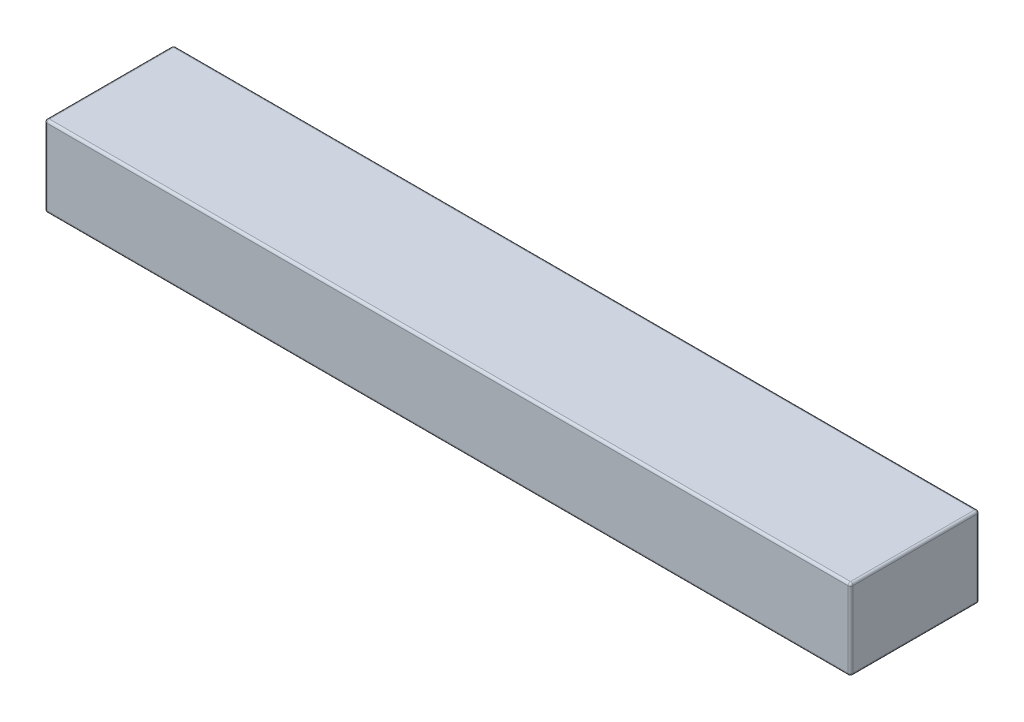
ISO-10303-21;
HEADER;
FILE_DESCRIPTION(('STEP AP214'),'2;1');
FILE_NAME('part.step','',(''),(''),'','','');
FILE_SCHEMA(('AUTOMOTIVE_DESIGN { 1 0 10303 214 1 1 1 1 }'));
ENDSEC;
DATA;
#1=APPLICATION_CONTEXT('core data for automotive mechanical design processes');
#2=APPLICATION_PROTOCOL_DEFINITION('international standard','automotive_design',2000,#1);
#3=PRODUCT_CONTEXT('',#1,'mechanical');
#4=PRODUCT('Part','Part','',(#3));
#5=PRODUCT_RELATED_PRODUCT_CATEGORY('part','',(#4));
#6=PRODUCT_DEFINITION_FORMATION('','',#4);
#7=PRODUCT_DEFINITION_CONTEXT('part definition',#1,'design');
#8=PRODUCT_DEFINITION('design','',#6,#7);
#9=PRODUCT_DEFINITION_SHAPE('','',#8);
#10=(LENGTH_UNIT() NAMED_UNIT(*) SI_UNIT(.MILLI.,.METRE.));
#11=(NAMED_UNIT(*) PLANE_ANGLE_UNIT() SI_UNIT($,.RADIAN.));
#12=(NAMED_UNIT(*) SI_UNIT($,.STERADIAN.) SOLID_ANGLE_UNIT());
#13=UNCERTAINTY_MEASURE_WITH_UNIT(LENGTH_MEASURE(1.E-05),#10,'distance_accuracy_value','');
#14=(GEOMETRIC_REPRESENTATION_CONTEXT(3) GLOBAL_UNCERTAINTY_ASSIGNED_CONTEXT((#13)) GLOBAL_UNIT_ASSIGNED_CONTEXT((#10,
#11,#12)) REPRESENTATION_CONTEXT('',''));
#15=CARTESIAN_POINT('',(0.,0.,0.));
#16=DIRECTION('',(0.,0.,1.));
#17=DIRECTION('',(1.,0.,0.));
#18=AXIS2_PLACEMENT_3D('',#15,#16,#17);
#19=CARTESIAN_POINT('',(50.,-5.4,7.7));
#20=DIRECTION('',(-1.,0.,0.));
#21=DIRECTION('',(0.,0.,1.));
#22=AXIS2_PLACEMENT_3D('',#19,#20,#21);
#23=CYLINDRICAL_SURFACE('',#22,0.3);
#24=DIRECTION('',(-1.,0.,0.));
#25=VECTOR('',#24,1.);
#26=CARTESIAN_POINT('',(50.,-5.4,8.));
#27=LINE('',#26,#25);
#28=CARTESIAN_POINT('',(49.7,-5.4,8.));
#29=VERTEX_POINT('',#28);
#30=CARTESIAN_POINT('',(-49.7,-5.4,8.));
#31=VERTEX_POINT('',#30);
#32=EDGE_CURVE('E229',#29,#31,#27,.T.);
#33=ORIENTED_EDGE('',*,*,#32,.T.);
#34=CARTESIAN_POINT('',(-49.7,-5.4,7.7));
#35=DIRECTION('',(-1.,0.,0.));
#36=DIRECTION('',(0.,0.,1.));
#37=AXIS2_PLACEMENT_3D('',#34,#35,#36);
#38=CIRCLE('',#37,0.3);
#39=CARTESIAN_POINT('',(-49.7,-5.7,7.7));
#40=VERTEX_POINT('',#39);
#41=EDGE_CURVE('E201',#31,#40,#38,.F.);
#42=ORIENTED_EDGE('',*,*,#41,.T.);
#43=DIRECTION('',(-1.,0.,0.));
#44=VECTOR('',#43,1.);
#45=CARTESIAN_POINT('',(50.,-5.7,7.7));
#46=LINE('',#45,#44);
#47=CARTESIAN_POINT('',(49.7,-5.7,7.7));
#48=VERTEX_POINT('',#47);
#49=EDGE_CURVE('E149',#48,#40,#46,.T.);
#50=ORIENTED_EDGE('',*,*,#49,.F.);
#51=CARTESIAN_POINT('',(49.7,-5.4,7.7));
#52=DIRECTION('',(-1.,0.,0.));
#53=DIRECTION('',(0.,0.,1.));
#54=AXIS2_PLACEMENT_3D('',#51,#52,#53);
#55=CIRCLE('',#54,0.3);
#56=EDGE_CURVE('E199',#48,#29,#55,.T.);
#57=ORIENTED_EDGE('',*,*,#56,.T.);
#58=EDGE_LOOP('',(#33,#42,#50,#57));
#59=FACE_BOUND('',#58,.T.);
#60=ADVANCED_FACE('F37',(#59),#23,.T.);
#61=CARTESIAN_POINT('',(50.,-5.7,7.7));
#62=DIRECTION('',(0.,1.,0.));
#63=DIRECTION('',(0.,0.,1.));
#64=AXIS2_PLACEMENT_3D('',#61,#62,#63);
#65=PLANE('',#64);
#66=ORIENTED_EDGE('',*,*,#49,.T.);
#67=DIRECTION('',(0.,0.,-1.));
#68=VECTOR('',#67,1.);
#69=CARTESIAN_POINT('',(-49.7,-5.7,-7.7));
#70=LINE('',#69,#68);
#71=CARTESIAN_POINT('',(-49.7,-5.7,-7.7));
#72=VERTEX_POINT('',#71);
#73=EDGE_CURVE('E148',#40,#72,#70,.T.);
#74=ORIENTED_EDGE('',*,*,#73,.T.);
#75=DIRECTION('',(-1.,0.,0.));
#76=VECTOR('',#75,1.);
#77=CARTESIAN_POINT('',(50.,-5.7,-7.7));
#78=LINE('',#77,#76);
#79=CARTESIAN_POINT('',(49.7,-5.7,-7.7));
#80=VERTEX_POINT('',#79);
#81=EDGE_CURVE('E130',#80,#72,#78,.T.);
#82=ORIENTED_EDGE('',*,*,#81,.F.);
#83=DIRECTION('',(0.,0.,-1.));
#84=VECTOR('',#83,1.);
#85=CARTESIAN_POINT('',(49.7,-5.7,7.7));
#86=LINE('',#85,#84);
#87=EDGE_CURVE('E145',#80,#48,#86,.F.);
#88=ORIENTED_EDGE('',*,*,#87,.T.);
#89=EDGE_LOOP('',(#66,#74,#82,#88));
#90=FACE_BOUND('',#89,.T.);
#91=ADVANCED_FACE('F143',(#90),#65,.F.);
#92=CARTESIAN_POINT('',(50.,-5.4,-7.7));
#93=DIRECTION('',(-1.,0.,0.));
#94=DIRECTION('',(0.,0.,1.));
#95=AXIS2_PLACEMENT_3D('',#92,#93,#94);
#96=CYLINDRICAL_SURFACE('',#95,0.3);
#97=ORIENTED_EDGE('',*,*,#81,.T.);
#98=CARTESIAN_POINT('',(-49.7,-5.4,-7.7));
#99=DIRECTION('',(-1.,0.,0.));
#100=DIRECTION('',(0.,0.,1.));
#101=AXIS2_PLACEMENT_3D('',#98,#99,#100);
#102=CIRCLE('',#101,0.3);
#103=CARTESIAN_POINT('',(-49.7,-5.4,-8.));
#104=VERTEX_POINT('',#103);
#105=EDGE_CURVE('E137',#72,#104,#102,.F.);
#106=ORIENTED_EDGE('',*,*,#105,.T.);
#107=DIRECTION('',(-1.,0.,0.));
#108=VECTOR('',#107,1.);
#109=CARTESIAN_POINT('',(50.,-5.4,-8.));
#110=LINE('',#109,#108);
#111=CARTESIAN_POINT('',(49.7,-5.4,-8.));
#112=VERTEX_POINT('',#111);
#113=EDGE_CURVE('E132',#112,#104,#110,.T.);
#114=ORIENTED_EDGE('',*,*,#113,.F.);
#115=CARTESIAN_POINT('',(49.7,-5.4,-7.7));
#116=DIRECTION('',(-1.,0.,0.));
#117=DIRECTION('',(0.,0.,1.));
#118=AXIS2_PLACEMENT_3D('',#115,#116,#117);
#119=CIRCLE('',#118,0.3);
#120=EDGE_CURVE('E127',#112,#80,#119,.T.);
#121=ORIENTED_EDGE('',*,*,#120,.T.);
#122=EDGE_LOOP('',(#97,#106,#114,#121));
#123=FACE_BOUND('',#122,.T.);
#124=ADVANCED_FACE('F129',(#123),#96,.T.);
#125=CARTESIAN_POINT('',(50.,-5.4,-8.));
#126=DIRECTION('',(0.,0.,1.));
#127=DIRECTION('',(1.,0.,0.));
#128=AXIS2_PLACEMENT_3D('',#125,#126,#127);
#129=PLANE('',#128);
#130=ORIENTED_EDGE('',*,*,#113,.T.);
#131=DIRECTION('',(0.,1.,0.));
#132=VECTOR('',#131,1.);
#133=CARTESIAN_POINT('',(-49.7,4.,-8.));
#134=LINE('',#133,#132);
#135=CARTESIAN_POINT('',(-49.7,4.,-8.));
#136=VERTEX_POINT('',#135);
#137=EDGE_CURVE('E180',#104,#136,#134,.T.);
#138=ORIENTED_EDGE('',*,*,#137,.T.);
#139=DIRECTION('',(-1.,0.,0.));
#140=VECTOR('',#139,1.);
#141=CARTESIAN_POINT('',(50.,4.,-8.));
#142=LINE('',#141,#140);
#143=CARTESIAN_POINT('',(49.7,4.,-8.));
#144=VERTEX_POINT('',#143);
#145=EDGE_CURVE('E250',#144,#136,#142,.T.);
#146=ORIENTED_EDGE('',*,*,#145,.F.);
#147=DIRECTION('',(0.,1.,0.));
#148=VECTOR('',#147,1.);
#149=CARTESIAN_POINT('',(49.7,-5.4,-8.));
#150=LINE('',#149,#148);
#151=EDGE_CURVE('E178',#144,#112,#150,.F.);
#152=ORIENTED_EDGE('',*,*,#151,.T.);
#153=EDGE_LOOP('',(#130,#138,#146,#152));
#154=FACE_BOUND('',#153,.T.);
#155=ADVANCED_FACE('F247',(#154),#129,.F.);
#156=CARTESIAN_POINT('',(50.,4.,-7.7));
#157=DIRECTION('',(-1.,0.,0.));
#158=DIRECTION('',(0.,0.,1.));
#159=AXIS2_PLACEMENT_3D('',#156,#157,#158);
#160=CYLINDRICAL_SURFACE('',#159,0.299999999999999);
#161=ORIENTED_EDGE('',*,*,#145,.T.);
#162=CARTESIAN_POINT('',(-49.7,4.,-7.7));
#163=DIRECTION('',(-1.,0.,0.));
#164=DIRECTION('',(0.,0.,1.));
#165=AXIS2_PLACEMENT_3D('',#162,#163,#164);
#166=CIRCLE('',#165,0.299999999999999);
#167=CARTESIAN_POINT('',(-49.7,4.3,-7.7));
#168=VERTEX_POINT('',#167);
#169=EDGE_CURVE('E184',#136,#168,#166,.F.);
#170=ORIENTED_EDGE('',*,*,#169,.T.);
#171=DIRECTION('',(-1.,0.,0.));
#172=VECTOR('',#171,1.);
#173=CARTESIAN_POINT('',(50.,4.3,-7.7));
#174=LINE('',#173,#172);
#175=CARTESIAN_POINT('',(49.7,4.3,-7.7));
#176=VERTEX_POINT('',#175);
#177=EDGE_CURVE('E253',#176,#168,#174,.T.);
#178=ORIENTED_EDGE('',*,*,#177,.F.);
#179=CARTESIAN_POINT('',(49.7,4.,-7.7));
#180=DIRECTION('',(-1.,0.,0.));
#181=DIRECTION('',(0.,0.,1.));
#182=AXIS2_PLACEMENT_3D('',#179,#180,#181);
#183=CIRCLE('',#182,0.299999999999999);
#184=EDGE_CURVE('E182',#176,#144,#183,.T.);
#185=ORIENTED_EDGE('',*,*,#184,.T.);
#186=EDGE_LOOP('',(#161,#170,#178,#185));
#187=FACE_BOUND('',#186,.T.);
#188=ADVANCED_FACE('F295',(#187),#160,.T.);
#189=CARTESIAN_POINT('',(50.,4.3,7.7));
#190=DIRECTION('',(0.,-1.,0.));
#191=DIRECTION('',(0.,0.,-1.));
#192=AXIS2_PLACEMENT_3D('',#189,#190,#191);
#193=PLANE('',#192);
#194=ORIENTED_EDGE('',*,*,#177,.T.);
#195=DIRECTION('',(0.,0.,1.));
#196=VECTOR('',#195,1.);
#197=CARTESIAN_POINT('',(-49.7,4.3,7.7));
#198=LINE('',#197,#196);
#199=CARTESIAN_POINT('',(-49.7,4.3,7.7));
#200=VERTEX_POINT('',#199);
#201=EDGE_CURVE('E188',#168,#200,#198,.T.);
#202=ORIENTED_EDGE('',*,*,#201,.T.);
#203=DIRECTION('',(-1.,0.,0.));
#204=VECTOR('',#203,1.);
#205=CARTESIAN_POINT('',(50.,4.3,7.7));
#206=LINE('',#205,#204);
#207=CARTESIAN_POINT('',(49.7,4.3,7.7));
#208=VERTEX_POINT('',#207);
#209=EDGE_CURVE('E257',#208,#200,#206,.T.);
#210=ORIENTED_EDGE('',*,*,#209,.F.);
#211=DIRECTION('',(0.,0.,1.));
#212=VECTOR('',#211,1.);
#213=CARTESIAN_POINT('',(49.7,4.3,7.7));
#214=LINE('',#213,#212);
#215=EDGE_CURVE('E186',#208,#176,#214,.F.);
#216=ORIENTED_EDGE('',*,*,#215,.T.);
#217=EDGE_LOOP('',(#194,#202,#210,#216));
#218=FACE_BOUND('',#217,.T.);
#219=ADVANCED_FACE('F298',(#218),#193,.F.);
#220=CARTESIAN_POINT('',(50.,4.,7.7));
#221=DIRECTION('',(-1.,0.,0.));
#222=DIRECTION('',(0.,0.,1.));
#223=AXIS2_PLACEMENT_3D('',#220,#221,#222);
#224=CYLINDRICAL_SURFACE('',#223,0.299999999999999);
#225=ORIENTED_EDGE('',*,*,#209,.T.);
#226=CARTESIAN_POINT('',(-49.7,4.,7.7));
#227=DIRECTION('',(-1.,0.,0.));
#228=DIRECTION('',(0.,0.,1.));
#229=AXIS2_PLACEMENT_3D('',#226,#227,#228);
#230=CIRCLE('',#229,0.299999999999999);
#231=CARTESIAN_POINT('',(-49.7,4.,8.));
#232=VERTEX_POINT('',#231);
#233=EDGE_CURVE('E192',#200,#232,#230,.F.);
#234=ORIENTED_EDGE('',*,*,#233,.T.);
#235=DIRECTION('',(-1.,0.,0.));
#236=VECTOR('',#235,1.);
#237=CARTESIAN_POINT('',(50.,4.,8.));
#238=LINE('',#237,#236);
#239=CARTESIAN_POINT('',(49.7,4.,8.));
#240=VERTEX_POINT('',#239);
#241=EDGE_CURVE('E262',#240,#232,#238,.T.);
#242=ORIENTED_EDGE('',*,*,#241,.F.);
#243=CARTESIAN_POINT('',(49.7,4.,7.7));
#244=DIRECTION('',(-1.,0.,0.));
#245=DIRECTION('',(0.,0.,1.));
#246=AXIS2_PLACEMENT_3D('',#243,#244,#245);
#247=CIRCLE('',#246,0.299999999999999);
#248=EDGE_CURVE('E190',#240,#208,#247,.T.);
#249=ORIENTED_EDGE('',*,*,#248,.T.);
#250=EDGE_LOOP('',(#225,#234,#242,#249));
#251=FACE_BOUND('',#250,.T.);
#252=ADVANCED_FACE('F311',(#251),#224,.T.);
#253=CARTESIAN_POINT('',(50.,-5.4,8.));
#254=DIRECTION('',(0.,0.,-1.));
#255=DIRECTION('',(-1.,0.,0.));
#256=AXIS2_PLACEMENT_3D('',#253,#254,#255);
#257=PLANE('',#256);
#258=ORIENTED_EDGE('',*,*,#241,.T.);
#259=DIRECTION('',(0.,-1.,0.));
#260=VECTOR('',#259,1.);
#261=CARTESIAN_POINT('',(-49.7,-5.4,8.));
#262=LINE('',#261,#260);
#263=EDGE_CURVE('E197',#232,#31,#262,.T.);
#264=ORIENTED_EDGE('',*,*,#263,.T.);
#265=ORIENTED_EDGE('',*,*,#32,.F.);
#266=DIRECTION('',(0.,-1.,0.));
#267=VECTOR('',#266,1.);
#268=CARTESIAN_POINT('',(49.7,-5.4,8.));
#269=LINE('',#268,#267);
#270=EDGE_CURVE('E194',#29,#240,#269,.F.);
#271=ORIENTED_EDGE('',*,*,#270,.T.);
#272=EDGE_LOOP('',(#258,#264,#265,#271));
#273=FACE_BOUND('',#272,.T.);
#274=ADVANCED_FACE('F312',(#273),#257,.F.);
#275=CARTESIAN_POINT('',(50.,-5.4,7.7));
#276=DIRECTION('',(-1.,0.,0.));
#277=DIRECTION('',(0.,0.,1.));
#278=AXIS2_PLACEMENT_3D('',#275,#276,#277);
#279=PLANE('',#278);
#280=DIRECTION('',(0.,0.,1.));
#281=VECTOR('',#280,1.);
#282=CARTESIAN_POINT('',(50.,4.,7.7));
#283=LINE('',#282,#281);
#284=CARTESIAN_POINT('',(50.,4.,-7.7));
#285=VERTEX_POINT('',#284);
#286=CARTESIAN_POINT('',(50.,4.,7.7));
#287=VERTEX_POINT('',#286);
#288=EDGE_CURVE('E46',#285,#287,#283,.T.);
#289=ORIENTED_EDGE('',*,*,#288,.T.);
#290=DIRECTION('',(0.,-1.,0.));
#291=VECTOR('',#290,1.);
#292=CARTESIAN_POINT('',(50.,-5.4,7.7));
#293=LINE('',#292,#291);
#294=CARTESIAN_POINT('',(50.,-5.4,7.7));
#295=VERTEX_POINT('',#294);
#296=EDGE_CURVE('E11',#287,#295,#293,.T.);
#297=ORIENTED_EDGE('',*,*,#296,.T.);
#298=DIRECTION('',(0.,0.,-1.));
#299=VECTOR('',#298,1.);
#300=CARTESIAN_POINT('',(50.,-5.4,7.7));
#301=LINE('',#300,#299);
#302=CARTESIAN_POINT('',(50.,-5.4,-7.7));
#303=VERTEX_POINT('',#302);
#304=EDGE_CURVE('E203',#295,#303,#301,.T.);
#305=ORIENTED_EDGE('',*,*,#304,.T.);
#306=DIRECTION('',(0.,1.,0.));
#307=VECTOR('',#306,1.);
#308=CARTESIAN_POINT('',(50.,-5.4,-7.7));
#309=LINE('',#308,#307);
#310=EDGE_CURVE('E57',#303,#285,#309,.T.);
#311=ORIENTED_EDGE('',*,*,#310,.T.);
#312=EDGE_LOOP('',(#289,#297,#305,#311));
#313=FACE_BOUND('',#312,.T.);
#314=ADVANCED_FACE('F321',(#313),#279,.F.);
#315=CARTESIAN_POINT('',(-50.,-5.4,7.7));
#316=DIRECTION('',(-1.,0.,0.));
#317=DIRECTION('',(0.,0.,1.));
#318=AXIS2_PLACEMENT_3D('',#315,#316,#317);
#319=PLANE('',#318);
#320=DIRECTION('',(0.,1.,0.));
#321=VECTOR('',#320,1.);
#322=CARTESIAN_POINT('',(-50.,-5.4,-7.7));
#323=LINE('',#322,#321);
#324=CARTESIAN_POINT('',(-50.,4.,-7.7));
#325=VERTEX_POINT('',#324);
#326=CARTESIAN_POINT('',(-50.,-5.4,-7.7));
#327=VERTEX_POINT('',#326);
#328=EDGE_CURVE('E173',#325,#327,#323,.F.);
#329=ORIENTED_EDGE('',*,*,#328,.T.);
#330=DIRECTION('',(0.,0.,-1.));
#331=VECTOR('',#330,1.);
#332=CARTESIAN_POINT('',(-50.,-5.4,7.7));
#333=LINE('',#332,#331);
#334=CARTESIAN_POINT('',(-50.,-5.4,7.7));
#335=VERTEX_POINT('',#334);
#336=EDGE_CURVE('E138',#327,#335,#333,.F.);
#337=ORIENTED_EDGE('',*,*,#336,.T.);
#338=DIRECTION('',(0.,-1.,0.));
#339=VECTOR('',#338,1.);
#340=CARTESIAN_POINT('',(-50.,4.,7.7));
#341=LINE('',#340,#339);
#342=CARTESIAN_POINT('',(-50.,4.,7.7));
#343=VERTEX_POINT('',#342);
#344=EDGE_CURVE('E166',#335,#343,#341,.F.);
#345=ORIENTED_EDGE('',*,*,#344,.T.);
#346=DIRECTION('',(0.,0.,1.));
#347=VECTOR('',#346,1.);
#348=CARTESIAN_POINT('',(-50.,4.,-7.7));
#349=LINE('',#348,#347);
#350=EDGE_CURVE('E171',#343,#325,#349,.F.);
#351=ORIENTED_EDGE('',*,*,#350,.T.);
#352=EDGE_LOOP('',(#329,#337,#345,#351));
#353=FACE_BOUND('',#352,.T.);
#354=ADVANCED_FACE('F323',(#353),#319,.T.);
#355=CARTESIAN_POINT('',(-49.7,4.,7.7));
#356=DIRECTION('',(0.,0.,-1.));
#357=DIRECTION('',(-1.,0.,0.));
#358=AXIS2_PLACEMENT_3D('',#355,#356,#357);
#359=CYLINDRICAL_SURFACE('',#358,0.3);
#360=CARTESIAN_POINT('',(-49.7,4.,7.7));
#361=DIRECTION('',(0.,0.,1.));
#362=DIRECTION('',(1.,0.,0.));
#363=AXIS2_PLACEMENT_3D('',#360,#361,#362);
#364=CIRCLE('',#363,0.3);
#365=EDGE_CURVE('E226',#200,#343,#364,.T.);
#366=ORIENTED_EDGE('',*,*,#365,.F.);
#367=ORIENTED_EDGE('',*,*,#201,.F.);
#368=CARTESIAN_POINT('',(-49.7,4.,-7.7));
#369=DIRECTION('',(0.,0.,-1.));
#370=DIRECTION('',(-1.,0.,0.));
#371=AXIS2_PLACEMENT_3D('',#368,#369,#370);
#372=CIRCLE('',#371,0.3);
#373=EDGE_CURVE('E223',#325,#168,#372,.T.);
#374=ORIENTED_EDGE('',*,*,#373,.F.);
#375=ORIENTED_EDGE('',*,*,#350,.F.);
#376=EDGE_LOOP('',(#366,#367,#374,#375));
#377=FACE_BOUND('',#376,.T.);
#378=ADVANCED_FACE('F303',(#377),#359,.T.);
#379=CARTESIAN_POINT('',(-49.7,4.,7.7));
#380=DIRECTION('',(-1.,0.,0.));
#381=DIRECTION('',(0.,0.,1.));
#382=AXIS2_PLACEMENT_3D('',#379,#380,#381);
#383=SPHERICAL_SURFACE('',#382,0.3);
#384=ORIENTED_EDGE('',*,*,#233,.F.);
#385=ORIENTED_EDGE('',*,*,#365,.T.);
#386=CARTESIAN_POINT('',(-49.7,4.,7.7));
#387=DIRECTION('',(0.,-1.,0.));
#388=DIRECTION('',(0.,0.,-1.));
#389=AXIS2_PLACEMENT_3D('',#386,#387,#388);
#390=CIRCLE('',#389,0.3);
#391=EDGE_CURVE('E220',#232,#343,#390,.T.);
#392=ORIENTED_EDGE('',*,*,#391,.F.);
#393=EDGE_LOOP('',(#384,#385,#392));
#394=FACE_BOUND('',#393,.T.);
#395=ADVANCED_FACE('F308',(#394),#383,.T.);
#396=CARTESIAN_POINT('',(-49.7,4.,-7.7));
#397=DIRECTION('',(-1.,0.,0.));
#398=DIRECTION('',(0.,0.,1.));
#399=AXIS2_PLACEMENT_3D('',#396,#397,#398);
#400=SPHERICAL_SURFACE('',#399,0.3);
#401=ORIENTED_EDGE('',*,*,#373,.T.);
#402=ORIENTED_EDGE('',*,*,#169,.F.);
#403=CARTESIAN_POINT('',(-49.7,4.,-7.7));
#404=DIRECTION('',(0.,-1.,0.));
#405=DIRECTION('',(0.,0.,-1.));
#406=AXIS2_PLACEMENT_3D('',#403,#404,#405);
#407=CIRCLE('',#406,0.3);
#408=EDGE_CURVE('E217',#325,#136,#407,.T.);
#409=ORIENTED_EDGE('',*,*,#408,.F.);
#410=EDGE_LOOP('',(#401,#402,#409));
#411=FACE_BOUND('',#410,.T.);
#412=ADVANCED_FACE('F292',(#411),#400,.T.);
#413=CARTESIAN_POINT('',(-49.7,-5.4,7.7));
#414=DIRECTION('',(0.,1.,0.));
#415=DIRECTION('',(0.,0.,1.));
#416=AXIS2_PLACEMENT_3D('',#413,#414,#415);
#417=CYLINDRICAL_SURFACE('',#416,0.3);
#418=ORIENTED_EDGE('',*,*,#391,.T.);
#419=ORIENTED_EDGE('',*,*,#344,.F.);
#420=CARTESIAN_POINT('',(-49.7,-5.4,7.7));
#421=DIRECTION('',(0.,-1.,0.));
#422=DIRECTION('',(0.,0.,-1.));
#423=AXIS2_PLACEMENT_3D('',#420,#421,#422);
#424=CIRCLE('',#423,0.3);
#425=EDGE_CURVE('E214',#31,#335,#424,.T.);
#426=ORIENTED_EDGE('',*,*,#425,.F.);
#427=ORIENTED_EDGE('',*,*,#263,.F.);
#428=EDGE_LOOP('',(#418,#419,#426,#427));
#429=FACE_BOUND('',#428,.T.);
#430=ADVANCED_FACE('F275',(#429),#417,.T.);
#431=CARTESIAN_POINT('',(-49.7,-5.4,-7.7));
#432=DIRECTION('',(0.,-1.,0.));
#433=DIRECTION('',(0.,0.,-1.));
#434=AXIS2_PLACEMENT_3D('',#431,#432,#433);
#435=CYLINDRICAL_SURFACE('',#434,0.3);
#436=ORIENTED_EDGE('',*,*,#408,.T.);
#437=ORIENTED_EDGE('',*,*,#137,.F.);
#438=CARTESIAN_POINT('',(-49.7,-5.4,-7.7));
#439=DIRECTION('',(0.,-1.,0.));
#440=DIRECTION('',(0.,0.,-1.));
#441=AXIS2_PLACEMENT_3D('',#438,#439,#440);
#442=CIRCLE('',#441,0.3);
#443=EDGE_CURVE('E211',#327,#104,#442,.T.);
#444=ORIENTED_EDGE('',*,*,#443,.F.);
#445=ORIENTED_EDGE('',*,*,#328,.F.);
#446=EDGE_LOOP('',(#436,#437,#444,#445));
#447=FACE_BOUND('',#446,.T.);
#448=ADVANCED_FACE('F289',(#447),#435,.T.);
#449=CARTESIAN_POINT('',(-49.7,-5.4,7.7));
#450=DIRECTION('',(-1.,0.,0.));
#451=DIRECTION('',(0.,0.,1.));
#452=AXIS2_PLACEMENT_3D('',#449,#450,#451);
#453=SPHERICAL_SURFACE('',#452,0.3);
#454=ORIENTED_EDGE('',*,*,#41,.F.);
#455=ORIENTED_EDGE('',*,*,#425,.T.);
#456=CARTESIAN_POINT('',(-49.7,-5.4,7.7));
#457=DIRECTION('',(0.,0.,-1.));
#458=DIRECTION('',(-1.,0.,0.));
#459=AXIS2_PLACEMENT_3D('',#456,#457,#458);
#460=CIRCLE('',#459,0.3);
#461=EDGE_CURVE('E209',#40,#335,#460,.T.);
#462=ORIENTED_EDGE('',*,*,#461,.F.);
#463=EDGE_LOOP('',(#454,#455,#462));
#464=FACE_BOUND('',#463,.T.);
#465=ADVANCED_FACE('F278',(#464),#453,.T.);
#466=CARTESIAN_POINT('',(-49.7,-5.4,-7.7));
#467=DIRECTION('',(-1.,0.,0.));
#468=DIRECTION('',(0.,0.,1.));
#469=AXIS2_PLACEMENT_3D('',#466,#467,#468);
#470=SPHERICAL_SURFACE('',#469,0.3);
#471=ORIENTED_EDGE('',*,*,#443,.T.);
#472=ORIENTED_EDGE('',*,*,#105,.F.);
#473=CARTESIAN_POINT('',(-49.7,-5.4,-7.7));
#474=DIRECTION('',(0.,0.,1.));
#475=DIRECTION('',(1.,0.,0.));
#476=AXIS2_PLACEMENT_3D('',#473,#474,#475);
#477=CIRCLE('',#476,0.3);
#478=EDGE_CURVE('E207',#327,#72,#477,.T.);
#479=ORIENTED_EDGE('',*,*,#478,.F.);
#480=EDGE_LOOP('',(#471,#472,#479));
#481=FACE_BOUND('',#480,.T.);
#482=ADVANCED_FACE('F285',(#481),#470,.T.);
#483=CARTESIAN_POINT('',(-49.7,-5.4,7.7));
#484=DIRECTION('',(0.,0.,1.));
#485=DIRECTION('',(1.,0.,0.));
#486=AXIS2_PLACEMENT_3D('',#483,#484,#485);
#487=CYLINDRICAL_SURFACE('',#486,0.3);
#488=ORIENTED_EDGE('',*,*,#461,.T.);
#489=ORIENTED_EDGE('',*,*,#336,.F.);
#490=ORIENTED_EDGE('',*,*,#478,.T.);
#491=ORIENTED_EDGE('',*,*,#73,.F.);
#492=EDGE_LOOP('',(#488,#489,#490,#491));
#493=FACE_BOUND('',#492,.T.);
#494=ADVANCED_FACE('F281',(#493),#487,.T.);
#495=CARTESIAN_POINT('',(49.7,-5.4,-7.7));
#496=DIRECTION('',(0.,1.,0.));
#497=DIRECTION('',(0.,0.,1.));
#498=AXIS2_PLACEMENT_3D('',#495,#496,#497);
#499=CYLINDRICAL_SURFACE('',#498,0.3);
#500=CARTESIAN_POINT('',(49.7,-5.4,-7.7));
#501=DIRECTION('',(0.,-1.,0.));
#502=DIRECTION('',(0.,0.,-1.));
#503=AXIS2_PLACEMENT_3D('',#500,#501,#502);
#504=CIRCLE('',#503,0.3);
#505=EDGE_CURVE('E154',#112,#303,#504,.T.);
#506=ORIENTED_EDGE('',*,*,#505,.F.);
#507=ORIENTED_EDGE('',*,*,#151,.F.);
#508=CARTESIAN_POINT('',(49.7,4.,-7.7));
#509=DIRECTION('',(0.,1.,0.));
#510=DIRECTION('',(0.,0.,1.));
#511=AXIS2_PLACEMENT_3D('',#508,#509,#510);
#512=CIRCLE('',#511,0.3);
#513=EDGE_CURVE('E41',#285,#144,#512,.T.);
#514=ORIENTED_EDGE('',*,*,#513,.F.);
#515=ORIENTED_EDGE('',*,*,#310,.F.);
#516=EDGE_LOOP('',(#506,#507,#514,#515));
#517=FACE_BOUND('',#516,.T.);
#518=ADVANCED_FACE('F39',(#517),#499,.T.);
#519=CARTESIAN_POINT('',(49.7,4.,-7.7));
#520=DIRECTION('',(-1.,0.,0.));
#521=DIRECTION('',(0.,0.,1.));
#522=AXIS2_PLACEMENT_3D('',#519,#520,#521);
#523=SPHERICAL_SURFACE('',#522,0.3);
#524=ORIENTED_EDGE('',*,*,#513,.T.);
#525=ORIENTED_EDGE('',*,*,#184,.F.);
#526=CARTESIAN_POINT('',(49.7,4.,-7.7));
#527=DIRECTION('',(0.,0.,1.));
#528=DIRECTION('',(1.,0.,0.));
#529=AXIS2_PLACEMENT_3D('',#526,#527,#528);
#530=CIRCLE('',#529,0.3);
#531=EDGE_CURVE('E157',#285,#176,#530,.T.);
#532=ORIENTED_EDGE('',*,*,#531,.F.);
#533=EDGE_LOOP('',(#524,#525,#532));
#534=FACE_BOUND('',#533,.T.);
#535=ADVANCED_FACE('F242',(#534),#523,.T.);
#536=CARTESIAN_POINT('',(49.7,-5.4,-7.7));
#537=DIRECTION('',(-1.,0.,0.));
#538=DIRECTION('',(0.,0.,1.));
#539=AXIS2_PLACEMENT_3D('',#536,#537,#538);
#540=SPHERICAL_SURFACE('',#539,0.3);
#541=ORIENTED_EDGE('',*,*,#120,.F.);
#542=ORIENTED_EDGE('',*,*,#505,.T.);
#543=CARTESIAN_POINT('',(49.7,-5.4,-7.7));
#544=DIRECTION('',(0.,0.,1.));
#545=DIRECTION('',(1.,0.,0.));
#546=AXIS2_PLACEMENT_3D('',#543,#544,#545);
#547=CIRCLE('',#546,0.3);
#548=EDGE_CURVE('E152',#80,#303,#547,.T.);
#549=ORIENTED_EDGE('',*,*,#548,.F.);
#550=EDGE_LOOP('',(#541,#542,#549));
#551=FACE_BOUND('',#550,.T.);
#552=ADVANCED_FACE('F153',(#551),#540,.T.);
#553=CARTESIAN_POINT('',(49.7,4.,7.7));
#554=DIRECTION('',(0.,0.,1.));
#555=DIRECTION('',(1.,0.,0.));
#556=AXIS2_PLACEMENT_3D('',#553,#554,#555);
#557=CYLINDRICAL_SURFACE('',#556,0.3);
#558=ORIENTED_EDGE('',*,*,#531,.T.);
#559=ORIENTED_EDGE('',*,*,#215,.F.);
#560=CARTESIAN_POINT('',(49.7,4.,7.7));
#561=DIRECTION('',(0.,0.,1.));
#562=DIRECTION('',(1.,0.,0.));
#563=AXIS2_PLACEMENT_3D('',#560,#561,#562);
#564=CIRCLE('',#563,0.3);
#565=EDGE_CURVE('E158',#287,#208,#564,.T.);
#566=ORIENTED_EDGE('',*,*,#565,.F.);
#567=ORIENTED_EDGE('',*,*,#288,.F.);
#568=EDGE_LOOP('',(#558,#559,#566,#567));
#569=FACE_BOUND('',#568,.T.);
#570=ADVANCED_FACE('F366',(#569),#557,.T.);
#571=CARTESIAN_POINT('',(49.7,-5.4,7.7));
#572=DIRECTION('',(0.,0.,-1.));
#573=DIRECTION('',(-1.,0.,0.));
#574=AXIS2_PLACEMENT_3D('',#571,#572,#573);
#575=CYLINDRICAL_SURFACE('',#574,0.3);
#576=ORIENTED_EDGE('',*,*,#548,.T.);
#577=ORIENTED_EDGE('',*,*,#304,.F.);
#578=CARTESIAN_POINT('',(49.7,-5.4,7.7));
#579=DIRECTION('',(0.,0.,1.));
#580=DIRECTION('',(1.,0.,0.));
#581=AXIS2_PLACEMENT_3D('',#578,#579,#580);
#582=CIRCLE('',#581,0.3);
#583=EDGE_CURVE('E163',#48,#295,#582,.T.);
#584=ORIENTED_EDGE('',*,*,#583,.F.);
#585=ORIENTED_EDGE('',*,*,#87,.F.);
#586=EDGE_LOOP('',(#576,#577,#584,#585));
#587=FACE_BOUND('',#586,.T.);
#588=ADVANCED_FACE('F161',(#587),#575,.T.);
#589=CARTESIAN_POINT('',(49.7,4.,7.7));
#590=DIRECTION('',(-1.,0.,0.));
#591=DIRECTION('',(0.,0.,1.));
#592=AXIS2_PLACEMENT_3D('',#589,#590,#591);
#593=SPHERICAL_SURFACE('',#592,0.3);
#594=ORIENTED_EDGE('',*,*,#565,.T.);
#595=ORIENTED_EDGE('',*,*,#248,.F.);
#596=CARTESIAN_POINT('',(49.7,4.,7.7));
#597=DIRECTION('',(0.,-1.,0.));
#598=DIRECTION('',(0.,0.,-1.));
#599=AXIS2_PLACEMENT_3D('',#596,#597,#598);
#600=CIRCLE('',#599,0.3);
#601=EDGE_CURVE('E232',#287,#240,#600,.T.);
#602=ORIENTED_EDGE('',*,*,#601,.F.);
#603=EDGE_LOOP('',(#594,#595,#602));
#604=FACE_BOUND('',#603,.T.);
#605=ADVANCED_FACE('F360',(#604),#593,.T.);
#606=CARTESIAN_POINT('',(49.7,-5.4,7.7));
#607=DIRECTION('',(-1.,0.,0.));
#608=DIRECTION('',(0.,0.,1.));
#609=AXIS2_PLACEMENT_3D('',#606,#607,#608);
#610=SPHERICAL_SURFACE('',#609,0.3);
#611=ORIENTED_EDGE('',*,*,#56,.F.);
#612=ORIENTED_EDGE('',*,*,#583,.T.);
#613=CARTESIAN_POINT('',(49.7,-5.4,7.7));
#614=DIRECTION('',(0.,1.,0.));
#615=DIRECTION('',(0.,0.,1.));
#616=AXIS2_PLACEMENT_3D('',#613,#614,#615);
#617=CIRCLE('',#616,0.3);
#618=EDGE_CURVE('E230',#29,#295,#617,.T.);
#619=ORIENTED_EDGE('',*,*,#618,.F.);
#620=EDGE_LOOP('',(#611,#612,#619));
#621=FACE_BOUND('',#620,.T.);
#622=ADVANCED_FACE('F320',(#621),#610,.T.);
#623=CARTESIAN_POINT('',(49.7,-5.4,7.7));
#624=DIRECTION('',(0.,-1.,0.));
#625=DIRECTION('',(0.,0.,-1.));
#626=AXIS2_PLACEMENT_3D('',#623,#624,#625);
#627=CYLINDRICAL_SURFACE('',#626,0.3);
#628=ORIENTED_EDGE('',*,*,#601,.T.);
#629=ORIENTED_EDGE('',*,*,#270,.F.);
#630=ORIENTED_EDGE('',*,*,#618,.T.);
#631=ORIENTED_EDGE('',*,*,#296,.F.);
#632=EDGE_LOOP('',(#628,#629,#630,#631));
#633=FACE_BOUND('',#632,.T.);
#634=ADVANCED_FACE('F315',(#633),#627,.T.);
#635=CLOSED_SHELL('',(#60,#91,#124,#155,#188,#219,#252,#274,#314,#354,#378,#395,#412,#430,#448,
#465,#482,#494,#518,#535,#552,#570,#588,#605,#622,#634));
#636=MANIFOLD_SOLID_BREP('B2',#635);
#637=ADVANCED_BREP_SHAPE_REPRESENTATION('',(#18,#636),#14);
#638=SHAPE_DEFINITION_REPRESENTATION(#9,#637);
ENDSEC;
END-ISO-10303-21;
